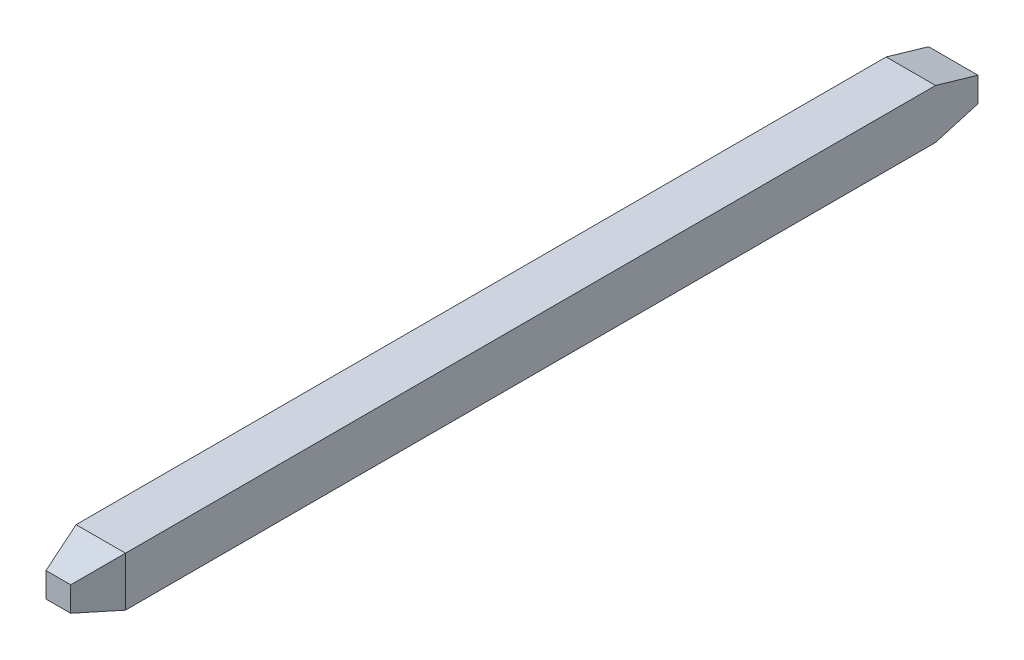
ISO-10303-21;
HEADER;
FILE_DESCRIPTION(('STEP AP214'),'2;1');
FILE_NAME('part.step','',(''),(''),'','','');
FILE_SCHEMA(('AUTOMOTIVE_DESIGN { 1 0 10303 214 1 1 1 1 }'));
ENDSEC;
DATA;
#1=APPLICATION_CONTEXT('core data for automotive mechanical design processes');
#2=APPLICATION_PROTOCOL_DEFINITION('international standard','automotive_design',2000,#1);
#3=PRODUCT_CONTEXT('',#1,'mechanical');
#4=PRODUCT('Part','Part','',(#3));
#5=PRODUCT_RELATED_PRODUCT_CATEGORY('part','',(#4));
#6=PRODUCT_DEFINITION_FORMATION('','',#4);
#7=PRODUCT_DEFINITION_CONTEXT('part definition',#1,'design');
#8=PRODUCT_DEFINITION('design','',#6,#7);
#9=PRODUCT_DEFINITION_SHAPE('','',#8);
#10=(LENGTH_UNIT() NAMED_UNIT(*) SI_UNIT(.MILLI.,.METRE.));
#11=(NAMED_UNIT(*) PLANE_ANGLE_UNIT() SI_UNIT($,.RADIAN.));
#12=(NAMED_UNIT(*) SI_UNIT($,.STERADIAN.) SOLID_ANGLE_UNIT());
#13=UNCERTAINTY_MEASURE_WITH_UNIT(LENGTH_MEASURE(1.E-05),#10,'distance_accuracy_value','');
#14=(GEOMETRIC_REPRESENTATION_CONTEXT(3) GLOBAL_UNCERTAINTY_ASSIGNED_CONTEXT((#13)) GLOBAL_UNIT_ASSIGNED_CONTEXT((#10,
#11,#12)) REPRESENTATION_CONTEXT('',''));
#15=CARTESIAN_POINT('',(0.,0.,0.));
#16=DIRECTION('',(0.,0.,1.));
#17=DIRECTION('',(1.,0.,0.));
#18=AXIS2_PLACEMENT_3D('',#15,#16,#17);
#19=CARTESIAN_POINT('',(-0.32,0.32,5.25));
#20=DIRECTION('',(0.,0.960195296603575,0.279329540830131));
#21=DIRECTION('',(0.,-0.279329540830131,0.960195296603575));
#22=AXIS2_PLACEMENT_3D('',#19,#20,#21);
#23=PLANE('',#22);
#24=DIRECTION('',(1.,0.,0.));
#25=VECTOR('',#24,1.);
#26=CARTESIAN_POINT('',(-0.32,0.16,5.8));
#27=LINE('',#26,#25);
#28=CARTESIAN_POINT('',(-0.16,0.16,5.8));
#29=VERTEX_POINT('',#28);
#30=CARTESIAN_POINT('',(0.16,0.16,5.8));
#31=VERTEX_POINT('',#30);
#32=EDGE_CURVE('E38',#29,#31,#27,.T.);
#33=ORIENTED_EDGE('',*,*,#32,.T.);
#34=DIRECTION('',(0.269031078562836,0.269031078562837,-0.92479433255975));
#35=VECTOR('',#34,1.);
#36=CARTESIAN_POINT('',(0.273678258411083,0.273678258411083,5.4092309867119));
#37=LINE('',#36,#35);
#38=CARTESIAN_POINT('',(0.32,0.32,5.25));
#39=VERTEX_POINT('',#38);
#40=EDGE_CURVE('E103',#31,#39,#37,.T.);
#41=ORIENTED_EDGE('',*,*,#40,.T.);
#42=DIRECTION('',(1.,0.,0.));
#43=VECTOR('',#42,1.);
#44=CARTESIAN_POINT('',(-0.32,0.32,5.25));
#45=LINE('',#44,#43);
#46=CARTESIAN_POINT('',(-0.32,0.32,5.25));
#47=VERTEX_POINT('',#46);
#48=EDGE_CURVE('E11',#47,#39,#45,.T.);
#49=ORIENTED_EDGE('',*,*,#48,.F.);
#50=DIRECTION('',(-0.269031078562836,0.269031078562837,-0.92479433255975));
#51=VECTOR('',#50,1.);
#52=CARTESIAN_POINT('',(-0.32,0.32,5.25));
#53=LINE('',#52,#51);
#54=EDGE_CURVE('E51',#29,#47,#53,.T.);
#55=ORIENTED_EDGE('',*,*,#54,.F.);
#56=EDGE_LOOP('',(#33,#41,#49,#55));
#57=FACE_BOUND('',#56,.T.);
#58=ADVANCED_FACE('F35',(#57),#23,.T.);
#59=CARTESIAN_POINT('',(-0.32,-0.16,5.8));
#60=DIRECTION('',(0.,-0.960195296603575,0.279329540830131));
#61=DIRECTION('',(0.,-0.279329540830131,-0.960195296603575));
#62=AXIS2_PLACEMENT_3D('',#59,#60,#61);
#63=PLANE('',#62);
#64=DIRECTION('',(1.,0.,0.));
#65=VECTOR('',#64,1.);
#66=CARTESIAN_POINT('',(-0.32,-0.32,5.25));
#67=LINE('',#66,#65);
#68=CARTESIAN_POINT('',(-0.32,-0.32,5.25));
#69=VERTEX_POINT('',#68);
#70=CARTESIAN_POINT('',(0.32,-0.32,5.25));
#71=VERTEX_POINT('',#70);
#72=EDGE_CURVE('E152',#69,#71,#67,.T.);
#73=ORIENTED_EDGE('',*,*,#72,.T.);
#74=DIRECTION('',(-0.269031078562836,0.269031078562836,0.92479433255975));
#75=VECTOR('',#74,1.);
#76=CARTESIAN_POINT('',(0.125258693808312,-0.125258693808312,5.91942324003393));
#77=LINE('',#76,#75);
#78=CARTESIAN_POINT('',(0.16,-0.16,5.8));
#79=VERTEX_POINT('',#78);
#80=EDGE_CURVE('E106',#71,#79,#77,.T.);
#81=ORIENTED_EDGE('',*,*,#80,.T.);
#82=DIRECTION('',(1.,0.,0.));
#83=VECTOR('',#82,1.);
#84=CARTESIAN_POINT('',(-0.32,-0.16,5.8));
#85=LINE('',#84,#83);
#86=CARTESIAN_POINT('',(-0.16,-0.16,5.8));
#87=VERTEX_POINT('',#86);
#88=EDGE_CURVE('E153',#87,#79,#85,.T.);
#89=ORIENTED_EDGE('',*,*,#88,.F.);
#90=DIRECTION('',(0.269031078562836,0.269031078562836,0.92479433255975));
#91=VECTOR('',#90,1.);
#92=CARTESIAN_POINT('',(-0.171580435397229,-0.171580435397229,5.76019225332202));
#93=LINE('',#92,#91);
#94=EDGE_CURVE('E163',#69,#87,#93,.T.);
#95=ORIENTED_EDGE('',*,*,#94,.F.);
#96=EDGE_LOOP('',(#73,#81,#89,#95));
#97=FACE_BOUND('',#96,.T.);
#98=ADVANCED_FACE('F162',(#97),#63,.T.);
#99=CARTESIAN_POINT('',(-0.32,0.16,5.8));
#100=DIRECTION('',(0.,0.,1.));
#101=DIRECTION('',(1.,0.,0.));
#102=AXIS2_PLACEMENT_3D('',#99,#100,#101);
#103=PLANE('',#102);
#104=ORIENTED_EDGE('',*,*,#88,.T.);
#105=DIRECTION('',(0.,-1.,0.));
#106=VECTOR('',#105,1.);
#107=CARTESIAN_POINT('',(0.16,0.32,5.8));
#108=LINE('',#107,#106);
#109=EDGE_CURVE('E111',#31,#79,#108,.T.);
#110=ORIENTED_EDGE('',*,*,#109,.F.);
#111=ORIENTED_EDGE('',*,*,#32,.F.);
#112=DIRECTION('',(0.,-1.,0.));
#113=VECTOR('',#112,1.);
#114=CARTESIAN_POINT('',(-0.16,0.32,5.8));
#115=LINE('',#114,#113);
#116=EDGE_CURVE('E159',#29,#87,#115,.T.);
#117=ORIENTED_EDGE('',*,*,#116,.T.);
#118=EDGE_LOOP('',(#104,#110,#111,#117));
#119=FACE_BOUND('',#118,.T.);
#120=ADVANCED_FACE('F158',(#119),#103,.T.);
#121=CARTESIAN_POINT('',(0.32,0.,0.));
#122=DIRECTION('',(1.,0.,0.));
#123=DIRECTION('',(0.,0.,-1.));
#124=AXIS2_PLACEMENT_3D('',#121,#122,#123);
#125=PLANE('',#124);
#126=DIRECTION('',(0.,0.,1.));
#127=VECTOR('',#126,1.);
#128=CARTESIAN_POINT('',(0.32,0.32,-5.25));
#129=LINE('',#128,#127);
#130=CARTESIAN_POINT('',(0.32,0.32,-5.25));
#131=VERTEX_POINT('',#130);
#132=EDGE_CURVE('E120',#131,#39,#129,.T.);
#133=ORIENTED_EDGE('',*,*,#132,.T.);
#134=DIRECTION('',(0.,-1.,0.));
#135=VECTOR('',#134,1.);
#136=CARTESIAN_POINT('',(0.32,0.32,5.25));
#137=LINE('',#136,#135);
#138=EDGE_CURVE('E100',#39,#71,#137,.T.);
#139=ORIENTED_EDGE('',*,*,#138,.T.);
#140=DIRECTION('',(0.,0.,-1.));
#141=VECTOR('',#140,1.);
#142=CARTESIAN_POINT('',(0.32,-0.32,5.25));
#143=LINE('',#142,#141);
#144=CARTESIAN_POINT('',(0.32,-0.32,-5.25));
#145=VERTEX_POINT('',#144);
#146=EDGE_CURVE('E173',#71,#145,#143,.T.);
#147=ORIENTED_EDGE('',*,*,#146,.T.);
#148=DIRECTION('',(0.,0.279329540830131,-0.960195296603575));
#149=VECTOR('',#148,1.);
#150=CARTESIAN_POINT('',(0.32,-0.32,-5.25));
#151=LINE('',#150,#149);
#152=CARTESIAN_POINT('',(0.32,-0.16,-5.8));
#153=VERTEX_POINT('',#152);
#154=EDGE_CURVE('E175',#145,#153,#151,.T.);
#155=ORIENTED_EDGE('',*,*,#154,.T.);
#156=DIRECTION('',(0.,1.,0.));
#157=VECTOR('',#156,1.);
#158=CARTESIAN_POINT('',(0.32,-0.16,-5.8));
#159=LINE('',#158,#157);
#160=CARTESIAN_POINT('',(0.32,0.16,-5.8));
#161=VERTEX_POINT('',#160);
#162=EDGE_CURVE('E133',#153,#161,#159,.T.);
#163=ORIENTED_EDGE('',*,*,#162,.T.);
#164=DIRECTION('',(0.,0.279329540830131,0.960195296603575));
#165=VECTOR('',#164,1.);
#166=CARTESIAN_POINT('',(0.32,0.16,-5.8));
#167=LINE('',#166,#165);
#168=EDGE_CURVE('E127',#161,#131,#167,.T.);
#169=ORIENTED_EDGE('',*,*,#168,.T.);
#170=EDGE_LOOP('',(#133,#139,#147,#155,#163,#169));
#171=FACE_BOUND('',#170,.T.);
#172=ADVANCED_FACE('F124',(#171),#125,.T.);
#173=CARTESIAN_POINT('',(-0.32,0.32,-5.25));
#174=DIRECTION('',(0.,1.,0.));
#175=DIRECTION('',(0.,0.,1.));
#176=AXIS2_PLACEMENT_3D('',#173,#174,#175);
#177=PLANE('',#176);
#178=ORIENTED_EDGE('',*,*,#48,.T.);
#179=ORIENTED_EDGE('',*,*,#132,.F.);
#180=DIRECTION('',(1.,0.,0.));
#181=VECTOR('',#180,1.);
#182=CARTESIAN_POINT('',(-0.32,0.32,-5.25));
#183=LINE('',#182,#181);
#184=CARTESIAN_POINT('',(-0.32,0.32,-5.25));
#185=VERTEX_POINT('',#184);
#186=EDGE_CURVE('E43',#185,#131,#183,.T.);
#187=ORIENTED_EDGE('',*,*,#186,.F.);
#188=DIRECTION('',(0.,0.,1.));
#189=VECTOR('',#188,1.);
#190=CARTESIAN_POINT('',(-0.32,0.32,-5.25));
#191=LINE('',#190,#189);
#192=EDGE_CURVE('E122',#185,#47,#191,.T.);
#193=ORIENTED_EDGE('',*,*,#192,.T.);
#194=EDGE_LOOP('',(#178,#179,#187,#193));
#195=FACE_BOUND('',#194,.T.);
#196=ADVANCED_FACE('F119',(#195),#177,.T.);
#197=CARTESIAN_POINT('',(-0.32,0.16,-5.8));
#198=DIRECTION('',(0.,0.960195296603575,-0.279329540830131));
#199=DIRECTION('',(0.,0.279329540830131,0.960195296603575));
#200=AXIS2_PLACEMENT_3D('',#197,#198,#199);
#201=PLANE('',#200);
#202=ORIENTED_EDGE('',*,*,#186,.T.);
#203=ORIENTED_EDGE('',*,*,#168,.F.);
#204=DIRECTION('',(1.,0.,0.));
#205=VECTOR('',#204,1.);
#206=CARTESIAN_POINT('',(-0.32,0.16,-5.8));
#207=LINE('',#206,#205);
#208=CARTESIAN_POINT('',(-0.32,0.16,-5.8));
#209=VERTEX_POINT('',#208);
#210=EDGE_CURVE('E146',#209,#161,#207,.T.);
#211=ORIENTED_EDGE('',*,*,#210,.F.);
#212=DIRECTION('',(0.,0.279329540830131,0.960195296603575));
#213=VECTOR('',#212,1.);
#214=CARTESIAN_POINT('',(-0.32,0.16,-5.8));
#215=LINE('',#214,#213);
#216=EDGE_CURVE('E142',#209,#185,#215,.T.);
#217=ORIENTED_EDGE('',*,*,#216,.T.);
#218=EDGE_LOOP('',(#202,#203,#211,#217));
#219=FACE_BOUND('',#218,.T.);
#220=ADVANCED_FACE('F181',(#219),#201,.T.);
#221=CARTESIAN_POINT('',(-0.32,-0.16,-5.8));
#222=DIRECTION('',(0.,0.,-1.));
#223=DIRECTION('',(-1.,0.,0.));
#224=AXIS2_PLACEMENT_3D('',#221,#222,#223);
#225=PLANE('',#224);
#226=ORIENTED_EDGE('',*,*,#210,.T.);
#227=ORIENTED_EDGE('',*,*,#162,.F.);
#228=DIRECTION('',(1.,0.,0.));
#229=VECTOR('',#228,1.);
#230=CARTESIAN_POINT('',(-0.32,-0.16,-5.8));
#231=LINE('',#230,#229);
#232=CARTESIAN_POINT('',(-0.32,-0.16,-5.8));
#233=VERTEX_POINT('',#232);
#234=EDGE_CURVE('E148',#233,#153,#231,.T.);
#235=ORIENTED_EDGE('',*,*,#234,.F.);
#236=DIRECTION('',(0.,1.,0.));
#237=VECTOR('',#236,1.);
#238=CARTESIAN_POINT('',(-0.32,-0.16,-5.8));
#239=LINE('',#238,#237);
#240=EDGE_CURVE('E139',#233,#209,#239,.T.);
#241=ORIENTED_EDGE('',*,*,#240,.T.);
#242=EDGE_LOOP('',(#226,#227,#235,#241));
#243=FACE_BOUND('',#242,.T.);
#244=ADVANCED_FACE('F214',(#243),#225,.T.);
#245=CARTESIAN_POINT('',(-0.32,-0.32,-5.25));
#246=DIRECTION('',(0.,-0.960195296603575,-0.279329540830131));
#247=DIRECTION('',(0.,0.279329540830131,-0.960195296603575));
#248=AXIS2_PLACEMENT_3D('',#245,#246,#247);
#249=PLANE('',#248);
#250=ORIENTED_EDGE('',*,*,#234,.T.);
#251=ORIENTED_EDGE('',*,*,#154,.F.);
#252=DIRECTION('',(1.,0.,0.));
#253=VECTOR('',#252,1.);
#254=CARTESIAN_POINT('',(-0.32,-0.32,-5.25));
#255=LINE('',#254,#253);
#256=CARTESIAN_POINT('',(-0.32,-0.32,-5.25));
#257=VERTEX_POINT('',#256);
#258=EDGE_CURVE('E150',#257,#145,#255,.T.);
#259=ORIENTED_EDGE('',*,*,#258,.F.);
#260=DIRECTION('',(0.,0.279329540830131,-0.960195296603575));
#261=VECTOR('',#260,1.);
#262=CARTESIAN_POINT('',(-0.32,-0.32,-5.25));
#263=LINE('',#262,#261);
#264=EDGE_CURVE('E131',#257,#233,#263,.T.);
#265=ORIENTED_EDGE('',*,*,#264,.T.);
#266=EDGE_LOOP('',(#250,#251,#259,#265));
#267=FACE_BOUND('',#266,.T.);
#268=ADVANCED_FACE('F210',(#267),#249,.T.);
#269=CARTESIAN_POINT('',(-0.32,-0.32,5.25));
#270=DIRECTION('',(0.,-1.,0.));
#271=DIRECTION('',(0.,0.,-1.));
#272=AXIS2_PLACEMENT_3D('',#269,#270,#271);
#273=PLANE('',#272);
#274=ORIENTED_EDGE('',*,*,#258,.T.);
#275=ORIENTED_EDGE('',*,*,#146,.F.);
#276=ORIENTED_EDGE('',*,*,#72,.F.);
#277=DIRECTION('',(0.,0.,-1.));
#278=VECTOR('',#277,1.);
#279=CARTESIAN_POINT('',(-0.32,-0.32,5.25));
#280=LINE('',#279,#278);
#281=EDGE_CURVE('E128',#69,#257,#280,.T.);
#282=ORIENTED_EDGE('',*,*,#281,.T.);
#283=EDGE_LOOP('',(#274,#275,#276,#282));
#284=FACE_BOUND('',#283,.T.);
#285=ADVANCED_FACE('F196',(#284),#273,.T.);
#286=CARTESIAN_POINT('',(-0.32,0.,0.));
#287=DIRECTION('',(1.,0.,0.));
#288=DIRECTION('',(0.,0.,-1.));
#289=AXIS2_PLACEMENT_3D('',#286,#287,#288);
#290=PLANE('',#289);
#291=ORIENTED_EDGE('',*,*,#281,.F.);
#292=DIRECTION('',(0.,-1.,0.));
#293=VECTOR('',#292,1.);
#294=CARTESIAN_POINT('',(-0.32,0.32,5.25));
#295=LINE('',#294,#293);
#296=EDGE_CURVE('E117',#47,#69,#295,.T.);
#297=ORIENTED_EDGE('',*,*,#296,.F.);
#298=ORIENTED_EDGE('',*,*,#192,.F.);
#299=ORIENTED_EDGE('',*,*,#216,.F.);
#300=ORIENTED_EDGE('',*,*,#240,.F.);
#301=ORIENTED_EDGE('',*,*,#264,.F.);
#302=EDGE_LOOP('',(#291,#297,#298,#299,#300,#301));
#303=FACE_BOUND('',#302,.T.);
#304=ADVANCED_FACE('F186',(#303),#290,.F.);
#305=CARTESIAN_POINT('',(-0.32,0.32,5.25));
#306=DIRECTION('',(0.960195296603575,0.,-0.279329540830131));
#307=DIRECTION('',(-0.279329540830131,0.,-0.960195296603576));
#308=AXIS2_PLACEMENT_3D('',#305,#306,#307);
#309=PLANE('',#308);
#310=ORIENTED_EDGE('',*,*,#54,.T.);
#311=ORIENTED_EDGE('',*,*,#296,.T.);
#312=ORIENTED_EDGE('',*,*,#94,.T.);
#313=ORIENTED_EDGE('',*,*,#116,.F.);
#314=EDGE_LOOP('',(#310,#311,#312,#313));
#315=FACE_BOUND('',#314,.T.);
#316=ADVANCED_FACE('F188',(#315),#309,.F.);
#317=CARTESIAN_POINT('',(0.32,0.32,5.25));
#318=DIRECTION('',(0.960195296603575,0.,0.279329540830131));
#319=DIRECTION('',(0.279329540830131,0.,-0.960195296603576));
#320=AXIS2_PLACEMENT_3D('',#317,#318,#319);
#321=PLANE('',#320);
#322=ORIENTED_EDGE('',*,*,#109,.T.);
#323=ORIENTED_EDGE('',*,*,#80,.F.);
#324=ORIENTED_EDGE('',*,*,#138,.F.);
#325=ORIENTED_EDGE('',*,*,#40,.F.);
#326=EDGE_LOOP('',(#322,#323,#324,#325));
#327=FACE_BOUND('',#326,.T.);
#328=ADVANCED_FACE('F102',(#327),#321,.T.);
#329=CLOSED_SHELL('',(#58,#98,#120,#172,#196,#220,#244,#268,#285,#304,#316,#328));
#330=MANIFOLD_SOLID_BREP('B2',#329);
#331=ADVANCED_BREP_SHAPE_REPRESENTATION('',(#18,#330),#14);
#332=SHAPE_DEFINITION_REPRESENTATION(#9,#331);
ENDSEC;
END-ISO-10303-21;
